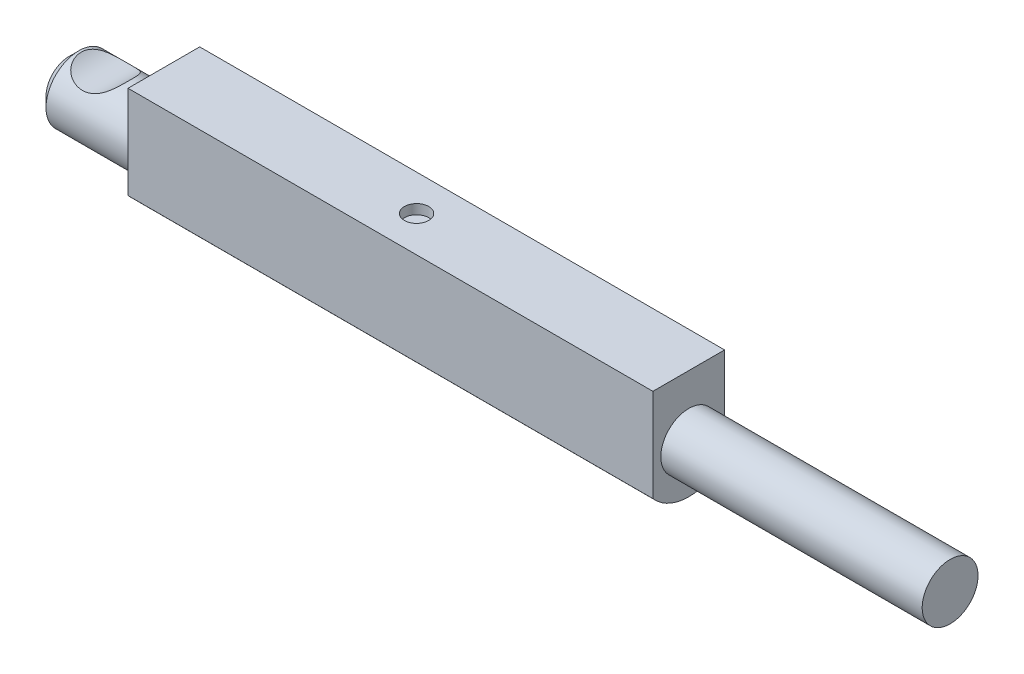
ISO-10303-21;
HEADER;
FILE_DESCRIPTION(('STEP AP214'),'2;1');
FILE_NAME('part.step','',(''),(''),'','','');
FILE_SCHEMA(('AUTOMOTIVE_DESIGN { 1 0 10303 214 1 1 1 1 }'));
ENDSEC;
DATA;
#1=APPLICATION_CONTEXT('core data for automotive mechanical design processes');
#2=APPLICATION_PROTOCOL_DEFINITION('international standard','automotive_design',2000,#1);
#3=PRODUCT_CONTEXT('',#1,'mechanical');
#4=PRODUCT('Part','Part','',(#3));
#5=PRODUCT_RELATED_PRODUCT_CATEGORY('part','',(#4));
#6=PRODUCT_DEFINITION_FORMATION('','',#4);
#7=PRODUCT_DEFINITION_CONTEXT('part definition',#1,'design');
#8=PRODUCT_DEFINITION('design','',#6,#7);
#9=PRODUCT_DEFINITION_SHAPE('','',#8);
#10=(LENGTH_UNIT() NAMED_UNIT(*) SI_UNIT(.MILLI.,.METRE.));
#11=(NAMED_UNIT(*) PLANE_ANGLE_UNIT() SI_UNIT($,.RADIAN.));
#12=(NAMED_UNIT(*) SI_UNIT($,.STERADIAN.) SOLID_ANGLE_UNIT());
#13=UNCERTAINTY_MEASURE_WITH_UNIT(LENGTH_MEASURE(1.E-05),#10,'distance_accuracy_value','');
#14=(GEOMETRIC_REPRESENTATION_CONTEXT(3) GLOBAL_UNCERTAINTY_ASSIGNED_CONTEXT((#13)) GLOBAL_UNIT_ASSIGNED_CONTEXT((#10,
#11,#12)) REPRESENTATION_CONTEXT('',''));
#15=CARTESIAN_POINT('',(0.,0.,0.));
#16=DIRECTION('',(0.,0.,1.));
#17=DIRECTION('',(1.,0.,0.));
#18=AXIS2_PLACEMENT_3D('',#15,#16,#17);
#19=CARTESIAN_POINT('',(0.,0.,0.));
#20=DIRECTION('',(1.,0.,0.));
#21=DIRECTION('',(0.,0.,-1.));
#22=AXIS2_PLACEMENT_3D('',#19,#20,#21);
#23=PLANE('',#22);
#24=CARTESIAN_POINT('',(0.,0.,0.));
#25=DIRECTION('',(1.,0.,0.));
#26=DIRECTION('',(0.,0.,-1.));
#27=AXIS2_PLACEMENT_3D('',#24,#25,#26);
#28=CIRCLE('',#27,0.950000000045748);
#29=CARTESIAN_POINT('',(0.,0.,-0.950000000045748));
#30=VERTEX_POINT('',#29);
#31=EDGE_CURVE('E19',#30,#30,#28,.T.);
#32=ORIENTED_EDGE('',*,*,#31,.F.);
#33=EDGE_LOOP('',(#32));
#34=FACE_BOUND('',#33,.T.);
#35=ADVANCED_FACE('F16',(#34),#23,.F.);
#36=CARTESIAN_POINT('',(14.3,2.1,0.));
#37=DIRECTION('',(0.,1.,0.));
#38=DIRECTION('',(0.,0.,1.));
#39=AXIS2_PLACEMENT_3D('',#36,#37,#38);
#40=PLANE('',#39);
#41=CARTESIAN_POINT('',(14.3,2.1,0.));
#42=DIRECTION('',(0.,1.,0.));
#43=DIRECTION('',(0.,0.,1.));
#44=AXIS2_PLACEMENT_3D('',#41,#42,#43);
#45=CIRCLE('',#44,0.5);
#46=CARTESIAN_POINT('',(14.3,2.1,0.5));
#47=VERTEX_POINT('',#46);
#48=EDGE_CURVE('E184',#47,#47,#45,.T.);
#49=ORIENTED_EDGE('',*,*,#48,.T.);
#50=EDGE_LOOP('',(#49));
#51=FACE_BOUND('',#50,.T.);
#52=ADVANCED_FACE('F192',(#51),#40,.T.);
#53=CARTESIAN_POINT('',(36.2559267586278,1.15,0.));
#54=DIRECTION('',(-1.,0.,0.));
#55=DIRECTION('',(0.,0.,1.));
#56=AXIS2_PLACEMENT_3D('',#53,#54,#55);
#57=PLANE('',#56);
#58=CARTESIAN_POINT('',(36.2559267586278,0.,0.));
#59=DIRECTION('',(-1.,0.,0.));
#60=DIRECTION('',(0.,0.,1.));
#61=AXIS2_PLACEMENT_3D('',#58,#59,#60);
#62=CIRCLE('',#61,1.15);
#63=CARTESIAN_POINT('',(36.2559267586278,0.,1.15));
#64=VERTEX_POINT('',#63);
#65=EDGE_CURVE('E127',#64,#64,#62,.T.);
#66=ORIENTED_EDGE('',*,*,#65,.F.);
#67=EDGE_LOOP('',(#66));
#68=FACE_BOUND('',#67,.T.);
#69=ADVANCED_FACE('F155',(#68),#57,.F.);
#70=CARTESIAN_POINT('',(1.5,2.43705128205128,5.));
#71=DIRECTION('',(0.,0.,-1.));
#72=DIRECTION('',(-1.,0.,0.));
#73=AXIS2_PLACEMENT_3D('',#70,#71,#72);
#74=CYLINDRICAL_SURFACE('',#73,1.47705128205128);
#75=CARTESIAN_POINT('',(0.5,1.35,0.));
#76=CARTESIAN_POINT('',(0.500000242369349,1.34999584711597,-0.050498977517769));
#77=CARTESIAN_POINT('',(0.503074911556701,1.34714600502022,-0.101036018912923));
#78=CARTESIAN_POINT('',(0.515480442430876,1.33592961658451,-0.200800418568723));
#79=CARTESIAN_POINT('',(0.524823890794471,1.32755197188776,-0.250024934338964));
#80=CARTESIAN_POINT('',(0.550012764218966,1.30591049312272,-0.345689295742837));
#81=CARTESIAN_POINT('',(0.565860431084247,1.29264497451571,-0.392128174921523));
#82=CARTESIAN_POINT('',(0.604253173333028,1.26235479914312,-0.480784281879079));
#83=CARTESIAN_POINT('',(0.626792952474594,1.24533311778833,-0.523004812940645));
#84=CARTESIAN_POINT('',(0.678109152515879,1.20939648765099,-0.601407482229218));
#85=CARTESIAN_POINT('',(0.706774607899758,1.19051808944874,-0.637679035689145));
#86=CARTESIAN_POINT('',(0.770146064532527,1.15238884401781,-0.704255054246484));
#87=CARTESIAN_POINT('',(0.804852581094058,1.13313796514054,-0.734559009827408));
#88=CARTESIAN_POINT('',(0.879389343738504,1.09606333961392,-0.788812753323953));
#89=CARTESIAN_POINT('',(0.919204616180566,1.07823565995126,-0.812780507960215));
#90=CARTESIAN_POINT('',(1.00298837713508,1.0454025766884,-0.854600866912566));
#91=CARTESIAN_POINT('',(1.04695821536355,1.03039809504417,-0.87245147514396));
#92=CARTESIAN_POINT('',(1.14066595246975,1.00349751226676,-0.903293559337735));
#93=CARTESIAN_POINT('',(1.19059193310716,0.99184499742233,-0.915924851870836));
#94=CARTESIAN_POINT('',(1.29250650650579,0.97372963322896,-0.935160335639309));
#95=CARTESIAN_POINT('',(1.3444959640668,0.967268984405478,-0.941761971420913));
#96=CARTESIAN_POINT('',(1.45335703503039,0.959652750579241,-0.949526790816609));
#97=CARTESIAN_POINT('',(1.51029400840302,0.95894858707624,-0.950227332228588));
#98=CARTESIAN_POINT('',(1.62358259851794,0.964086540590021,-0.945012995280188));
#99=CARTESIAN_POINT('',(1.67993402990043,0.969930670431719,-0.93909608283727));
#100=CARTESIAN_POINT('',(1.79188313143748,0.987990770759287,-0.920082169135297));
#101=CARTESIAN_POINT('',(1.8474259557178,1.0003637114025,-0.906807861385305));
#102=CARTESIAN_POINT('',(1.95443489383568,1.03054678356898,-0.872349964994514));
#103=CARTESIAN_POINT('',(2.0059030102886,1.04835422301817,-0.851170291259004));
#104=CARTESIAN_POINT('',(2.10047049604817,1.0866487810428,-0.801635023413712));
#105=CARTESIAN_POINT('',(2.14386219159502,1.10695379650108,-0.773698666449467));
#106=CARTESIAN_POINT('',(2.22389506629106,1.14875956043622,-0.710133286498884));
#107=CARTESIAN_POINT('',(2.26054135503701,1.17025938764476,-0.674510131012807));
#108=CARTESIAN_POINT('',(2.32347365709632,1.2103261485122,-0.59939169489176));
#109=CARTESIAN_POINT('',(2.35036103545207,1.22898925127698,-0.560449530111175));
#110=CARTESIAN_POINT('',(2.39740909324629,1.26351268463345,-0.477545700059013));
#111=CARTESIAN_POINT('',(2.41756630963399,1.27937157032798,-0.433581466214432));
#112=CARTESIAN_POINT('',(2.45079264850962,1.3065096420661,-0.343090669505035));
#113=CARTESIAN_POINT('',(2.4640251987962,1.31789267608399,-0.2966547237657));
#114=CARTESIAN_POINT('',(2.48435644255942,1.33573000119736,-0.201629039523889));
#115=CARTESIAN_POINT('',(2.49146652609884,1.34219344195123,-0.153043478000242));
#116=CARTESIAN_POINT('',(2.49856947255333,1.34868086131056,-0.0691981765780094));
#117=CARTESIAN_POINT('',(2.50002578777479,1.35002638614125,-0.0341472356940575));
#118=CARTESIAN_POINT('',(2.4999620328771,1.34996123767103,0.0514184835406339));
#119=CARTESIAN_POINT('',(2.49685002120721,1.34707698326201,0.10195008143463));
#120=CARTESIAN_POINT('',(2.48436893094374,1.33579455424914,0.201695005119015));
#121=CARTESIAN_POINT('',(2.47498737449848,1.32738538434312,0.250905498041029));
#122=CARTESIAN_POINT('',(2.44972103406522,1.30568627847519,0.346533718125707));
#123=CARTESIAN_POINT('',(2.43383395276303,1.29239461851676,0.392950452072234));
#124=CARTESIAN_POINT('',(2.39536186272631,1.26206042018852,0.481554811421826));
#125=CARTESIAN_POINT('',(2.37278212312375,1.24502083527301,0.523745728980054));
#126=CARTESIAN_POINT('',(2.32138976433767,1.20906024011609,0.602081310594755));
#127=CARTESIAN_POINT('',(2.29268848233274,1.19017573549694,0.638315810434602));
#128=CARTESIAN_POINT('',(2.22925005997929,1.15204511098184,0.704815421777056));
#129=CARTESIAN_POINT('',(2.19451240075094,1.13279896012615,0.735080019636076));
#130=CARTESIAN_POINT('',(2.11991379406374,1.09574019324172,0.78926024032212));
#131=CARTESIAN_POINT('',(2.08006694098903,1.07792384490343,0.81319279438278));
#132=CARTESIAN_POINT('',(1.99622605531831,1.04512158667541,0.854943322604505));
#133=CARTESIAN_POINT('',(1.95223067242111,1.03013660316436,0.872759297067879));
#134=CARTESIAN_POINT('',(1.85846960657099,1.00328027680326,0.903533911727288));
#135=CARTESIAN_POINT('',(1.8085157311397,0.99165355919624,0.916131478034968));
#136=CARTESIAN_POINT('',(1.70655211968929,0.973595782098149,0.935299057148385));
#137=CARTESIAN_POINT('',(1.65454152147821,0.967166926331558,0.941866513543378));
#138=CARTESIAN_POINT('',(1.54564766725126,0.959621179160793,0.94955838521813));
#139=CARTESIAN_POINT('',(1.48869969698882,0.958955620320176,0.950220451817001));
#140=CARTESIAN_POINT('',(1.37539845621741,0.964172079724718,0.944925941099864));
#141=CARTESIAN_POINT('',(1.31904537311964,0.970056102638142,0.9389673373581));
#142=CARTESIAN_POINT('',(1.20711582663638,0.988193149993495,0.919865631253227));
#143=CARTESIAN_POINT('',(1.15159399476495,1.00060171409042,0.906546649472324));
#144=CARTESIAN_POINT('',(1.044637769295,1.03084740878355,0.871996144814018));
#145=CARTESIAN_POINT('',(0.993201357319615,1.04868183746111,0.850768559006489));
#146=CARTESIAN_POINT('',(0.898715387185299,1.08701237896996,0.801143509698411));
#147=CARTESIAN_POINT('',(0.855371865682437,1.10732633015267,0.7731669820937));
#148=CARTESIAN_POINT('',(0.7754391590624,1.14913540551179,0.709526664184625));
#149=CARTESIAN_POINT('',(0.738844868891124,1.17062962084441,0.673868728653639));
#150=CARTESIAN_POINT('',(0.676010431822362,1.21067391922237,0.598690424389761));
#151=CARTESIAN_POINT('',(0.649169296297087,1.22932115427239,0.559722121547324));
#152=CARTESIAN_POINT('',(0.602211349042832,1.26380423073616,0.476774773258994));
#153=CARTESIAN_POINT('',(0.582098035254759,1.27963860768388,0.432793137154991));
#154=CARTESIAN_POINT('',(0.548950868944552,1.30672622059547,0.342266989316619));
#155=CARTESIAN_POINT('',(0.535755163972969,1.31808248880419,0.295812038967981));
#156=CARTESIAN_POINT('',(0.515496793415645,1.33586174439415,0.200756214095884));
#157=CARTESIAN_POINT('',(0.508422637145878,1.34229397200112,0.152159540850237));
#158=CARTESIAN_POINT('',(0.501431430574603,1.34868042983354,0.0689055352465011));
#159=CARTESIAN_POINT('',(0.499999834601739,1.35000283402087,0.0344616308020643));
#160=CARTESIAN_POINT('',(0.5,1.35,0.));
#161=B_SPLINE_CURVE_WITH_KNOTS('',3,(#75,#76,#77,#78,#79,#80,#81,#82,#83,#84,#85,#86,#87,#88,
#89,#90,#91,#92,#93,#94,#95,#96,#97,#98,#99,#100,#101,#102,#103,#104,#105,#106,#107,#108,#109,
#110,#111,#112,#113,#114,#115,#116,#117,#118,#119,#120,#121,#122,#123,#124,#125,#126,#127,#128,
#129,#130,#131,#132,#133,#134,#135,#136,#137,#138,#139,#140,#141,#142,#143,#144,#145,#146,#147,
#148,#149,#150,#151,#152,#153,#154,#155,#156,#157,#158,#159,#160),.UNSPECIFIED.,.T.,.F.,(4,2,2,
2,2,2,2,2,2,2,2,2,2,2,2,2,2,2,2,2,2,2,2,2,2,2,2,2,2,2,2,2,2,2,2,2,2,2,2,2,2,2,4),(0.,
0.151389030658048,0.303082938858006,0.454829175256485,0.606455635994378,0.755538494716431,
0.904634076693887,1.05330223996983,1.20201886903047,1.35975124421068,1.51755043762386,
1.68761596140581,1.85773377454527,2.03214166460212,2.20646329851156,2.37192858464145,
2.53726801152244,2.68911656868183,2.84104314056805,2.98920092121246,3.13708247414499,
3.24220575611363,3.39359289500501,3.54528223036935,3.69702517847124,3.84864897520404,
3.99772002999744,4.14680390510608,4.29548502164885,4.44421470042914,4.60198478722723,
4.75982172839093,4.92991709918576,5.10006454637098,5.2744654593384,5.44877966761186,
5.61420274615842,5.77950018246615,5.93131855496895,6.08321573890007,6.23137950749315,
6.37926455262617,6.48257581036766),.UNSPECIFIED.);
#162=CARTESIAN_POINT('',(0.5,1.35,0.));
#163=VERTEX_POINT('',#162);
#164=EDGE_CURVE('E112',#163,#163,#161,.T.);
#165=ORIENTED_EDGE('',*,*,#164,.F.);
#166=EDGE_LOOP('',(#165));
#167=FACE_BOUND('',#166,.T.);
#168=ADVANCED_FACE('F128',(#167),#74,.F.);
#169=CARTESIAN_POINT('',(0.399999999956435,0.,0.));
#170=DIRECTION('',(1.,0.,0.));
#171=DIRECTION('',(0.,0.,-1.));
#172=AXIS2_PLACEMENT_3D('',#169,#170,#171);
#173=CONICAL_SURFACE('',#172,1.35000000000218,0.785398163397448);
#174=CARTESIAN_POINT('',(0.399999999999998,0.,0.));
#175=DIRECTION('',(-1.,0.,0.));
#176=DIRECTION('',(0.,0.,1.));
#177=AXIS2_PLACEMENT_3D('',#174,#175,#176);
#178=CIRCLE('',#177,1.35);
#179=CARTESIAN_POINT('',(0.399999999999998,0.,1.35));
#180=VERTEX_POINT('',#179);
#181=EDGE_CURVE('E109',#180,#180,#178,.F.);
#182=ORIENTED_EDGE('',*,*,#181,.F.);
#183=EDGE_LOOP('',(#182));
#184=FACE_BOUND('',#183,.T.);
#185=ORIENTED_EDGE('',*,*,#31,.T.);
#186=EDGE_LOOP('',(#185));
#187=FACE_BOUND('',#186,.T.);
#188=ADVANCED_FACE('F147',(#184,#187),#173,.T.);
#189=CARTESIAN_POINT('',(14.3,2.1,0.));
#190=DIRECTION('',(0.,1.,0.));
#191=DIRECTION('',(0.,0.,1.));
#192=AXIS2_PLACEMENT_3D('',#189,#190,#191);
#193=CYLINDRICAL_SURFACE('',#192,0.5);
#194=ORIENTED_EDGE('',*,*,#48,.F.);
#195=EDGE_LOOP('',(#194));
#196=FACE_BOUND('',#195,.T.);
#197=CARTESIAN_POINT('',(14.3,2.5,0.));
#198=DIRECTION('',(0.,1.,0.));
#199=DIRECTION('',(0.,0.,1.));
#200=AXIS2_PLACEMENT_3D('',#197,#198,#199);
#201=CIRCLE('',#200,0.5);
#202=CARTESIAN_POINT('',(14.3,2.5,0.5));
#203=VERTEX_POINT('',#202);
#204=EDGE_CURVE('E71',#203,#203,#201,.T.);
#205=ORIENTED_EDGE('',*,*,#204,.T.);
#206=EDGE_LOOP('',(#205));
#207=FACE_BOUND('',#206,.T.);
#208=ADVANCED_FACE('F144',(#196,#207),#193,.F.);
#209=CARTESIAN_POINT('',(36.2559267586278,0.,0.));
#210=DIRECTION('',(-1.,0.,0.));
#211=DIRECTION('',(0.,0.,1.));
#212=AXIS2_PLACEMENT_3D('',#209,#210,#211);
#213=CYLINDRICAL_SURFACE('',#212,1.15);
#214=CARTESIAN_POINT('',(25.5,0.,0.));
#215=DIRECTION('',(-1.,0.,0.));
#216=DIRECTION('',(0.,0.,1.));
#217=AXIS2_PLACEMENT_3D('',#214,#215,#216);
#218=CIRCLE('',#217,1.15);
#219=CARTESIAN_POINT('',(25.5,0.,1.15));
#220=VERTEX_POINT('',#219);
#221=EDGE_CURVE('E100',#220,#220,#218,.F.);
#222=ORIENTED_EDGE('',*,*,#221,.T.);
#223=EDGE_LOOP('',(#222));
#224=FACE_BOUND('',#223,.T.);
#225=ORIENTED_EDGE('',*,*,#65,.T.);
#226=EDGE_LOOP('',(#225));
#227=FACE_BOUND('',#226,.T.);
#228=ADVANCED_FACE('F141',(#224,#227),#213,.T.);
#229=CARTESIAN_POINT('',(25.5,-1.3254901018824,-1.475));
#230=DIRECTION('',(0.,0.,1.));
#231=DIRECTION('',(1.,0.,0.));
#232=AXIS2_PLACEMENT_3D('',#229,#230,#231);
#233=PLANE('',#232);
#234=DIRECTION('',(1.,0.,0.));
#235=VECTOR('',#234,1.);
#236=CARTESIAN_POINT('',(25.5,2.5,-1.475));
#237=LINE('',#236,#235);
#238=CARTESIAN_POINT('',(3.9,2.5,-1.475));
#239=VERTEX_POINT('',#238);
#240=CARTESIAN_POINT('',(25.5,2.5,-1.475));
#241=VERTEX_POINT('',#240);
#242=EDGE_CURVE('E52',#239,#241,#237,.T.);
#243=ORIENTED_EDGE('',*,*,#242,.T.);
#244=DIRECTION('',(0.,1.,0.));
#245=VECTOR('',#244,1.);
#246=CARTESIAN_POINT('',(25.5,4.,-1.475));
#247=LINE('',#246,#245);
#248=CARTESIAN_POINT('',(25.5,-1.3254901018824,-1.475));
#249=VERTEX_POINT('',#248);
#250=EDGE_CURVE('E98',#241,#249,#247,.F.);
#251=ORIENTED_EDGE('',*,*,#250,.T.);
#252=DIRECTION('',(-1.,0.,0.));
#253=VECTOR('',#252,1.);
#254=CARTESIAN_POINT('',(25.5,-1.3254901018824,-1.475));
#255=LINE('',#254,#253);
#256=CARTESIAN_POINT('',(3.9,-1.3254901018824,-1.475));
#257=VERTEX_POINT('',#256);
#258=EDGE_CURVE('E46',#257,#249,#255,.F.);
#259=ORIENTED_EDGE('',*,*,#258,.F.);
#260=DIRECTION('',(0.,1.,0.));
#261=VECTOR('',#260,1.);
#262=CARTESIAN_POINT('',(3.9,1.35,-1.475));
#263=LINE('',#262,#261);
#264=EDGE_CURVE('E74',#257,#239,#263,.T.);
#265=ORIENTED_EDGE('',*,*,#264,.T.);
#266=EDGE_LOOP('',(#243,#251,#259,#265));
#267=FACE_BOUND('',#266,.T.);
#268=ADVANCED_FACE('F77',(#267),#233,.F.);
#269=CARTESIAN_POINT('',(36.2559267586278,0.,0.));
#270=DIRECTION('',(-1.,0.,0.));
#271=DIRECTION('',(0.,0.,1.));
#272=AXIS2_PLACEMENT_3D('',#269,#270,#271);
#273=CYLINDRICAL_SURFACE('',#272,1.35);
#274=ORIENTED_EDGE('',*,*,#181,.T.);
#275=EDGE_LOOP('',(#274));
#276=FACE_BOUND('',#275,.T.);
#277=CARTESIAN_POINT('',(3.9,0.,0.));
#278=DIRECTION('',(-1.,0.,0.));
#279=DIRECTION('',(0.,0.,1.));
#280=AXIS2_PLACEMENT_3D('',#277,#278,#279);
#281=CIRCLE('',#280,1.35);
#282=CARTESIAN_POINT('',(3.9,0.,1.35));
#283=VERTEX_POINT('',#282);
#284=EDGE_CURVE('E75',#283,#283,#281,.T.);
#285=ORIENTED_EDGE('',*,*,#284,.T.);
#286=EDGE_LOOP('',(#285));
#287=FACE_BOUND('',#286,.T.);
#288=ORIENTED_EDGE('',*,*,#164,.T.);
#289=EDGE_LOOP('',(#288));
#290=FACE_BOUND('',#289,.T.);
#291=ADVANCED_FACE('F132',(#276,#287,#290),#273,.T.);
#292=CARTESIAN_POINT('',(25.5,2.5,-1.475));
#293=DIRECTION('',(0.,-1.,0.));
#294=DIRECTION('',(0.,0.,-1.));
#295=AXIS2_PLACEMENT_3D('',#292,#293,#294);
#296=PLANE('',#295);
#297=DIRECTION('',(-1.,0.,0.));
#298=VECTOR('',#297,1.);
#299=CARTESIAN_POINT('',(25.5,2.5,1.475));
#300=LINE('',#299,#298);
#301=CARTESIAN_POINT('',(3.9,2.5,1.475));
#302=VERTEX_POINT('',#301);
#303=CARTESIAN_POINT('',(25.5,2.5,1.475));
#304=VERTEX_POINT('',#303);
#305=EDGE_CURVE('E62',#302,#304,#300,.F.);
#306=ORIENTED_EDGE('',*,*,#305,.T.);
#307=DIRECTION('',(0.,0.,1.));
#308=VECTOR('',#307,1.);
#309=CARTESIAN_POINT('',(25.5,2.5,0.));
#310=LINE('',#309,#308);
#311=EDGE_CURVE('E70',#304,#241,#310,.F.);
#312=ORIENTED_EDGE('',*,*,#311,.T.);
#313=ORIENTED_EDGE('',*,*,#242,.F.);
#314=DIRECTION('',(0.,0.,-1.));
#315=VECTOR('',#314,1.);
#316=CARTESIAN_POINT('',(3.9,2.5,0.));
#317=LINE('',#316,#315);
#318=EDGE_CURVE('E69',#239,#302,#317,.F.);
#319=ORIENTED_EDGE('',*,*,#318,.T.);
#320=EDGE_LOOP('',(#306,#312,#313,#319));
#321=FACE_BOUND('',#320,.T.);
#322=ORIENTED_EDGE('',*,*,#204,.F.);
#323=EDGE_LOOP('',(#322));
#324=FACE_BOUND('',#323,.T.);
#325=ADVANCED_FACE('F67',(#321,#324),#296,.F.);
#326=CARTESIAN_POINT('',(25.5,4.,0.));
#327=DIRECTION('',(-1.,0.,0.));
#328=DIRECTION('',(0.,0.,1.));
#329=AXIS2_PLACEMENT_3D('',#326,#327,#328);
#330=PLANE('',#329);
#331=ORIENTED_EDGE('',*,*,#221,.F.);
#332=EDGE_LOOP('',(#331));
#333=FACE_BOUND('',#332,.T.);
#334=ORIENTED_EDGE('',*,*,#311,.F.);
#335=DIRECTION('',(0.,1.,0.));
#336=VECTOR('',#335,1.);
#337=CARTESIAN_POINT('',(25.5,2.5,1.475));
#338=LINE('',#337,#336);
#339=CARTESIAN_POINT('',(25.5,-1.3254901018824,1.475));
#340=VERTEX_POINT('',#339);
#341=EDGE_CURVE('E85',#304,#340,#338,.F.);
#342=ORIENTED_EDGE('',*,*,#341,.T.);
#343=CARTESIAN_POINT('',(25.5,-0.0500000000000166,0.));
#344=DIRECTION('',(-1.,0.,0.));
#345=DIRECTION('',(0.,0.,1.));
#346=AXIS2_PLACEMENT_3D('',#343,#344,#345);
#347=CIRCLE('',#346,1.94999999999998);
#348=EDGE_CURVE('E79',#249,#340,#347,.T.);
#349=ORIENTED_EDGE('',*,*,#348,.F.);
#350=ORIENTED_EDGE('',*,*,#250,.F.);
#351=EDGE_LOOP('',(#334,#342,#349,#350));
#352=FACE_BOUND('',#351,.T.);
#353=ADVANCED_FACE('F171',(#333,#352),#330,.F.);
#354=CARTESIAN_POINT('',(25.5,-0.0500000000000166,0.));
#355=DIRECTION('',(-1.,0.,0.));
#356=DIRECTION('',(0.,0.,1.));
#357=AXIS2_PLACEMENT_3D('',#354,#355,#356);
#358=CYLINDRICAL_SURFACE('',#357,1.94999999999998);
#359=ORIENTED_EDGE('',*,*,#348,.T.);
#360=DIRECTION('',(-1.,0.,0.));
#361=VECTOR('',#360,1.);
#362=CARTESIAN_POINT('',(25.5,-1.3254901018824,1.475));
#363=LINE('',#362,#361);
#364=CARTESIAN_POINT('',(3.9,-1.3254901018824,1.475));
#365=VERTEX_POINT('',#364);
#366=EDGE_CURVE('E25',#340,#365,#363,.T.);
#367=ORIENTED_EDGE('',*,*,#366,.T.);
#368=CARTESIAN_POINT('',(3.9,-0.0500000000000166,0.));
#369=DIRECTION('',(-1.,0.,0.));
#370=DIRECTION('',(0.,0.,1.));
#371=AXIS2_PLACEMENT_3D('',#368,#369,#370);
#372=CIRCLE('',#371,1.94999999999998);
#373=EDGE_CURVE('E32',#365,#257,#372,.F.);
#374=ORIENTED_EDGE('',*,*,#373,.T.);
#375=ORIENTED_EDGE('',*,*,#258,.T.);
#376=EDGE_LOOP('',(#359,#367,#374,#375));
#377=FACE_BOUND('',#376,.T.);
#378=ADVANCED_FACE('F165',(#377),#358,.T.);
#379=CARTESIAN_POINT('',(3.9,1.35,0.));
#380=DIRECTION('',(1.,0.,0.));
#381=DIRECTION('',(0.,0.,-1.));
#382=AXIS2_PLACEMENT_3D('',#379,#380,#381);
#383=PLANE('',#382);
#384=ORIENTED_EDGE('',*,*,#284,.F.);
#385=EDGE_LOOP('',(#384));
#386=FACE_BOUND('',#385,.T.);
#387=ORIENTED_EDGE('',*,*,#318,.F.);
#388=ORIENTED_EDGE('',*,*,#264,.F.);
#389=ORIENTED_EDGE('',*,*,#373,.F.);
#390=DIRECTION('',(0.,1.,0.));
#391=VECTOR('',#390,1.);
#392=CARTESIAN_POINT('',(3.9,2.5,1.475));
#393=LINE('',#392,#391);
#394=EDGE_CURVE('E11',#365,#302,#393,.T.);
#395=ORIENTED_EDGE('',*,*,#394,.T.);
#396=EDGE_LOOP('',(#387,#388,#389,#395));
#397=FACE_BOUND('',#396,.T.);
#398=ADVANCED_FACE('F73',(#386,#397),#383,.F.);
#399=CARTESIAN_POINT('',(25.5,2.5,1.475));
#400=DIRECTION('',(0.,0.,-1.));
#401=DIRECTION('',(-1.,0.,0.));
#402=AXIS2_PLACEMENT_3D('',#399,#400,#401);
#403=PLANE('',#402);
#404=ORIENTED_EDGE('',*,*,#366,.F.);
#405=ORIENTED_EDGE('',*,*,#341,.F.);
#406=ORIENTED_EDGE('',*,*,#305,.F.);
#407=ORIENTED_EDGE('',*,*,#394,.F.);
#408=EDGE_LOOP('',(#404,#405,#406,#407));
#409=FACE_BOUND('',#408,.T.);
#410=ADVANCED_FACE('F159',(#409),#403,.F.);
#411=CLOSED_SHELL('',(#35,#52,#69,#168,#188,#208,#228,#268,#291,#325,#353,#378,#398,#410));
#412=MANIFOLD_SOLID_BREP('B1',#411);
#413=ADVANCED_BREP_SHAPE_REPRESENTATION('',(#18,#412),#14);
#414=SHAPE_DEFINITION_REPRESENTATION(#9,#413);
ENDSEC;
END-ISO-10303-21;
